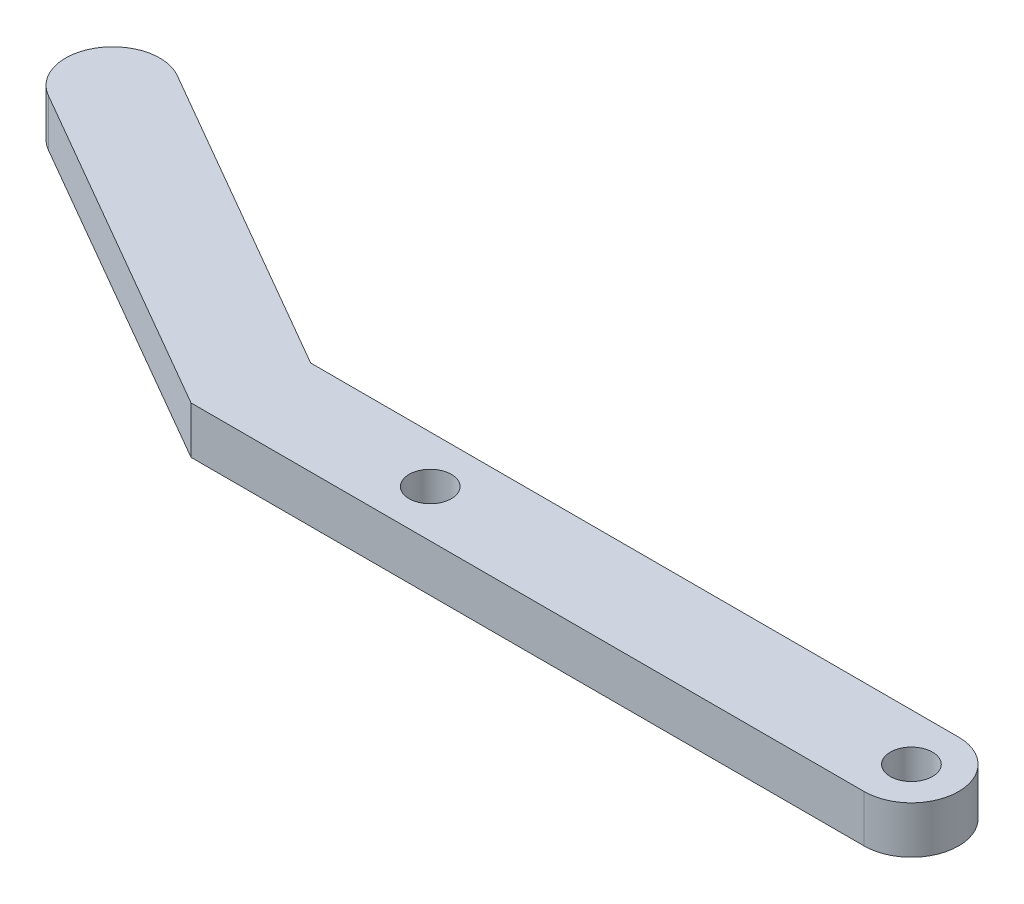
ISO-10303-21;
HEADER;
FILE_DESCRIPTION(('STEP AP214'),'2;1');
FILE_NAME('part.step','',(''),(''),'','','');
FILE_SCHEMA(('AUTOMOTIVE_DESIGN { 1 0 10303 214 1 1 1 1 }'));
ENDSEC;
DATA;
#1=APPLICATION_CONTEXT('core data for automotive mechanical design processes');
#2=APPLICATION_PROTOCOL_DEFINITION('international standard','automotive_design',2000,#1);
#3=PRODUCT_CONTEXT('',#1,'mechanical');
#4=PRODUCT('Part','Part','',(#3));
#5=PRODUCT_RELATED_PRODUCT_CATEGORY('part','',(#4));
#6=PRODUCT_DEFINITION_FORMATION('','',#4);
#7=PRODUCT_DEFINITION_CONTEXT('part definition',#1,'design');
#8=PRODUCT_DEFINITION('design','',#6,#7);
#9=PRODUCT_DEFINITION_SHAPE('','',#8);
#10=(LENGTH_UNIT() NAMED_UNIT(*) SI_UNIT(.MILLI.,.METRE.));
#11=(NAMED_UNIT(*) PLANE_ANGLE_UNIT() SI_UNIT($,.RADIAN.));
#12=(NAMED_UNIT(*) SI_UNIT($,.STERADIAN.) SOLID_ANGLE_UNIT());
#13=UNCERTAINTY_MEASURE_WITH_UNIT(LENGTH_MEASURE(1.E-05),#10,'distance_accuracy_value','');
#14=(GEOMETRIC_REPRESENTATION_CONTEXT(3) GLOBAL_UNCERTAINTY_ASSIGNED_CONTEXT((#13)) GLOBAL_UNIT_ASSIGNED_CONTEXT((#10,
#11,#12)) REPRESENTATION_CONTEXT('',''));
#15=CARTESIAN_POINT('',(0.,0.,0.));
#16=DIRECTION('',(0.,0.,1.));
#17=DIRECTION('',(1.,0.,0.));
#18=AXIS2_PLACEMENT_3D('',#15,#16,#17);
#19=CARTESIAN_POINT('',(-44.2220452561248,3.175,-12.6999999999999));
#20=DIRECTION('',(0.,1.,0.));
#21=DIRECTION('',(0.,0.,1.));
#22=AXIS2_PLACEMENT_3D('',#19,#20,#21);
#23=PLANE('',#22);
#24=CARTESIAN_POINT('',(22.225,3.175,0.));
#25=DIRECTION('',(0.,1.,0.));
#26=DIRECTION('',(0.,0.,1.));
#27=AXIS2_PLACEMENT_3D('',#24,#25,#26);
#28=CIRCLE('',#27,1.4224);
#29=CARTESIAN_POINT('',(22.225,3.175,1.4224));
#30=VERTEX_POINT('',#29);
#31=EDGE_CURVE('E122',#30,#30,#28,.T.);
#32=ORIENTED_EDGE('',*,*,#31,.F.);
#33=EDGE_LOOP('',(#32));
#34=FACE_BOUND('',#33,.T.);
#35=DIRECTION('',(-0.866025403784442,0.,-0.499999999999995));
#36=VECTOR('',#35,1.);
#37=CARTESIAN_POINT('',(-21.3742613140312,3.175,-3.175));
#38=LINE('',#37,#36);
#39=CARTESIAN_POINT('',(-21.3742613140312,3.175,-3.175));
#40=VERTEX_POINT('',#39);
#41=CARTESIAN_POINT('',(-42.6345452561248,3.175,-15.4496306570155));
#42=VERTEX_POINT('',#41);
#43=EDGE_CURVE('E129',#40,#42,#38,.T.);
#44=ORIENTED_EDGE('',*,*,#43,.T.);
#45=CARTESIAN_POINT('',(-44.2220452561248,3.175,-12.6999999999999));
#46=DIRECTION('',(0.,1.,0.));
#47=DIRECTION('',(0.,0.,1.));
#48=AXIS2_PLACEMENT_3D('',#45,#46,#47);
#49=CIRCLE('',#48,3.175);
#50=CARTESIAN_POINT('',(-45.8095452561248,3.175,-9.95036934298426));
#51=VERTEX_POINT('',#50);
#52=EDGE_CURVE('E87',#42,#51,#49,.T.);
#53=ORIENTED_EDGE('',*,*,#52,.T.);
#54=DIRECTION('',(0.866025403784442,0.,0.499999999999995));
#55=VECTOR('',#54,1.);
#56=CARTESIAN_POINT('',(-23.0757386859688,3.175,3.175));
#57=LINE('',#56,#55);
#58=CARTESIAN_POINT('',(-23.0757386859688,3.175,3.175));
#59=VERTEX_POINT('',#58);
#60=EDGE_CURVE('E100',#51,#59,#57,.T.);
#61=ORIENTED_EDGE('',*,*,#60,.T.);
#62=DIRECTION('',(1.,0.,0.));
#63=VECTOR('',#62,1.);
#64=CARTESIAN_POINT('',(-23.0757386859688,3.175,3.175));
#65=LINE('',#64,#63);
#66=CARTESIAN_POINT('',(22.225,3.175,3.175));
#67=VERTEX_POINT('',#66);
#68=EDGE_CURVE('E94',#59,#67,#65,.T.);
#69=ORIENTED_EDGE('',*,*,#68,.T.);
#70=CARTESIAN_POINT('',(22.225,3.175,0.));
#71=DIRECTION('',(0.,1.,0.));
#72=DIRECTION('',(0.,0.,-1.));
#73=AXIS2_PLACEMENT_3D('',#70,#71,#72);
#74=CIRCLE('',#73,3.175);
#75=CARTESIAN_POINT('',(22.225,3.175,-3.175));
#76=VERTEX_POINT('',#75);
#77=EDGE_CURVE('E98',#67,#76,#74,.T.);
#78=ORIENTED_EDGE('',*,*,#77,.T.);
#79=DIRECTION('',(-1.,0.,0.));
#80=VECTOR('',#79,1.);
#81=CARTESIAN_POINT('',(-21.3742613140312,3.175,-3.175));
#82=LINE('',#81,#80);
#83=EDGE_CURVE('E50',#76,#40,#82,.T.);
#84=ORIENTED_EDGE('',*,*,#83,.T.);
#85=EDGE_LOOP('',(#44,#53,#61,#69,#78,#84));
#86=FACE_BOUND('',#85,.T.);
#87=CARTESIAN_POINT('',(-10.15492,3.175,0.));
#88=DIRECTION('',(0.,1.,0.));
#89=DIRECTION('',(0.,0.,1.));
#90=AXIS2_PLACEMENT_3D('',#87,#88,#89);
#91=CIRCLE('',#90,1.4224);
#92=CARTESIAN_POINT('',(-10.15492,3.175,1.4224));
#93=VERTEX_POINT('',#92);
#94=EDGE_CURVE('E172',#93,#93,#91,.T.);
#95=ORIENTED_EDGE('',*,*,#94,.F.);
#96=EDGE_LOOP('',(#95));
#97=FACE_BOUND('',#96,.T.);
#98=ADVANCED_FACE('F33',(#34,#86,#97),#23,.T.);
#99=CARTESIAN_POINT('',(-44.2220452561248,0.,-12.6999999999999));
#100=DIRECTION('',(0.,1.,0.));
#101=DIRECTION('',(0.,0.,1.));
#102=AXIS2_PLACEMENT_3D('',#99,#100,#101);
#103=PLANE('',#102);
#104=CARTESIAN_POINT('',(22.225,0.,0.));
#105=DIRECTION('',(0.,1.,0.));
#106=DIRECTION('',(0.,0.,1.));
#107=AXIS2_PLACEMENT_3D('',#104,#105,#106);
#108=CIRCLE('',#107,1.4224);
#109=CARTESIAN_POINT('',(22.225,0.,1.4224));
#110=VERTEX_POINT('',#109);
#111=EDGE_CURVE('E177',#110,#110,#108,.T.);
#112=ORIENTED_EDGE('',*,*,#111,.T.);
#113=EDGE_LOOP('',(#112));
#114=FACE_BOUND('',#113,.T.);
#115=DIRECTION('',(-0.866025403784442,0.,-0.499999999999995));
#116=VECTOR('',#115,1.);
#117=CARTESIAN_POINT('',(-21.3742613140312,0.,-3.175));
#118=LINE('',#117,#116);
#119=CARTESIAN_POINT('',(-21.3742613140312,0.,-3.175));
#120=VERTEX_POINT('',#119);
#121=CARTESIAN_POINT('',(-42.6345452561248,0.,-15.4496306570155));
#122=VERTEX_POINT('',#121);
#123=EDGE_CURVE('E118',#120,#122,#118,.T.);
#124=ORIENTED_EDGE('',*,*,#123,.F.);
#125=DIRECTION('',(-1.,0.,0.));
#126=VECTOR('',#125,1.);
#127=CARTESIAN_POINT('',(-21.3742613140312,0.,-3.175));
#128=LINE('',#127,#126);
#129=CARTESIAN_POINT('',(22.225,0.,-3.175));
#130=VERTEX_POINT('',#129);
#131=EDGE_CURVE('E79',#130,#120,#128,.T.);
#132=ORIENTED_EDGE('',*,*,#131,.F.);
#133=CARTESIAN_POINT('',(22.225,0.,0.));
#134=DIRECTION('',(0.,1.,0.));
#135=DIRECTION('',(0.,0.,-1.));
#136=AXIS2_PLACEMENT_3D('',#133,#134,#135);
#137=CIRCLE('',#136,3.175);
#138=CARTESIAN_POINT('',(22.225,0.,3.175));
#139=VERTEX_POINT('',#138);
#140=EDGE_CURVE('E73',#139,#130,#137,.T.);
#141=ORIENTED_EDGE('',*,*,#140,.F.);
#142=DIRECTION('',(1.,0.,0.));
#143=VECTOR('',#142,1.);
#144=CARTESIAN_POINT('',(-23.0757386859688,0.,3.175));
#145=LINE('',#144,#143);
#146=CARTESIAN_POINT('',(-23.0757386859688,0.,3.175));
#147=VERTEX_POINT('',#146);
#148=EDGE_CURVE('E108',#147,#139,#145,.T.);
#149=ORIENTED_EDGE('',*,*,#148,.F.);
#150=DIRECTION('',(0.866025403784442,0.,0.499999999999995));
#151=VECTOR('',#150,1.);
#152=CARTESIAN_POINT('',(-23.0757386859688,0.,3.175));
#153=LINE('',#152,#151);
#154=CARTESIAN_POINT('',(-45.8095452561248,0.,-9.95036934298426));
#155=VERTEX_POINT('',#154);
#156=EDGE_CURVE('E124',#155,#147,#153,.T.);
#157=ORIENTED_EDGE('',*,*,#156,.F.);
#158=CARTESIAN_POINT('',(-44.2220452561248,0.,-12.6999999999999));
#159=DIRECTION('',(0.,1.,0.));
#160=DIRECTION('',(0.,0.,1.));
#161=AXIS2_PLACEMENT_3D('',#158,#159,#160);
#162=CIRCLE('',#161,3.175);
#163=EDGE_CURVE('E121',#122,#155,#162,.T.);
#164=ORIENTED_EDGE('',*,*,#163,.F.);
#165=EDGE_LOOP('',(#124,#132,#141,#149,#157,#164));
#166=FACE_BOUND('',#165,.T.);
#167=CARTESIAN_POINT('',(-10.15492,0.,0.));
#168=DIRECTION('',(0.,1.,0.));
#169=DIRECTION('',(0.,0.,1.));
#170=AXIS2_PLACEMENT_3D('',#167,#168,#169);
#171=CIRCLE('',#170,1.4224);
#172=CARTESIAN_POINT('',(-10.15492,0.,1.4224));
#173=VERTEX_POINT('',#172);
#174=EDGE_CURVE('E175',#173,#173,#171,.T.);
#175=ORIENTED_EDGE('',*,*,#174,.T.);
#176=EDGE_LOOP('',(#175));
#177=FACE_BOUND('',#176,.T.);
#178=ADVANCED_FACE('F138',(#114,#166,#177),#103,.F.);
#179=CARTESIAN_POINT('',(-21.3742613140312,3.175,-3.175));
#180=DIRECTION('',(-0.499999999999995,0.,0.866025403784442));
#181=DIRECTION('',(0.866025403784442,0.,0.499999999999995));
#182=AXIS2_PLACEMENT_3D('',#179,#180,#181);
#183=PLANE('',#182);
#184=ORIENTED_EDGE('',*,*,#123,.T.);
#185=DIRECTION('',(0.,-1.,0.));
#186=VECTOR('',#185,1.);
#187=CARTESIAN_POINT('',(-42.6345452561248,3.175,-15.4496306570155));
#188=LINE('',#187,#186);
#189=EDGE_CURVE('E11',#42,#122,#188,.T.);
#190=ORIENTED_EDGE('',*,*,#189,.F.);
#191=ORIENTED_EDGE('',*,*,#43,.F.);
#192=DIRECTION('',(0.,-1.,0.));
#193=VECTOR('',#192,1.);
#194=CARTESIAN_POINT('',(-21.3742613140312,3.175,-3.175));
#195=LINE('',#194,#193);
#196=EDGE_CURVE('E114',#40,#120,#195,.T.);
#197=ORIENTED_EDGE('',*,*,#196,.T.);
#198=EDGE_LOOP('',(#184,#190,#191,#197));
#199=FACE_BOUND('',#198,.T.);
#200=ADVANCED_FACE('F35',(#199),#183,.F.);
#201=CARTESIAN_POINT('',(-44.2220452561248,3.175,-12.6999999999999));
#202=DIRECTION('',(0.,-1.,0.));
#203=DIRECTION('',(0.,0.,-1.));
#204=AXIS2_PLACEMENT_3D('',#201,#202,#203);
#205=CYLINDRICAL_SURFACE('',#204,3.175);
#206=ORIENTED_EDGE('',*,*,#163,.T.);
#207=DIRECTION('',(0.,-1.,0.));
#208=VECTOR('',#207,1.);
#209=CARTESIAN_POINT('',(-45.8095452561248,3.175,-9.95036934298426));
#210=LINE('',#209,#208);
#211=EDGE_CURVE('E42',#51,#155,#210,.T.);
#212=ORIENTED_EDGE('',*,*,#211,.F.);
#213=ORIENTED_EDGE('',*,*,#52,.F.);
#214=ORIENTED_EDGE('',*,*,#189,.T.);
#215=EDGE_LOOP('',(#206,#212,#213,#214));
#216=FACE_BOUND('',#215,.T.);
#217=ADVANCED_FACE('F218',(#216),#205,.T.);
#218=CARTESIAN_POINT('',(-23.0757386859688,3.175,3.175));
#219=DIRECTION('',(0.499999999999995,0.,-0.866025403784442));
#220=DIRECTION('',(-0.866025403784442,0.,-0.499999999999995));
#221=AXIS2_PLACEMENT_3D('',#218,#219,#220);
#222=PLANE('',#221);
#223=ORIENTED_EDGE('',*,*,#156,.T.);
#224=DIRECTION('',(0.,-1.,0.));
#225=VECTOR('',#224,1.);
#226=CARTESIAN_POINT('',(-23.0757386859688,3.175,3.175));
#227=LINE('',#226,#225);
#228=EDGE_CURVE('E109',#59,#147,#227,.T.);
#229=ORIENTED_EDGE('',*,*,#228,.F.);
#230=ORIENTED_EDGE('',*,*,#60,.F.);
#231=ORIENTED_EDGE('',*,*,#211,.T.);
#232=EDGE_LOOP('',(#223,#229,#230,#231));
#233=FACE_BOUND('',#232,.T.);
#234=ADVANCED_FACE('F135',(#233),#222,.F.);
#235=CARTESIAN_POINT('',(-23.0757386859688,3.175,3.175));
#236=DIRECTION('',(0.,0.,-1.));
#237=DIRECTION('',(-1.,0.,0.));
#238=AXIS2_PLACEMENT_3D('',#235,#236,#237);
#239=PLANE('',#238);
#240=ORIENTED_EDGE('',*,*,#148,.T.);
#241=DIRECTION('',(0.,-1.,0.));
#242=VECTOR('',#241,1.);
#243=CARTESIAN_POINT('',(22.225,3.175,3.175));
#244=LINE('',#243,#242);
#245=EDGE_CURVE('E105',#67,#139,#244,.T.);
#246=ORIENTED_EDGE('',*,*,#245,.F.);
#247=ORIENTED_EDGE('',*,*,#68,.F.);
#248=ORIENTED_EDGE('',*,*,#228,.T.);
#249=EDGE_LOOP('',(#240,#246,#247,#248));
#250=FACE_BOUND('',#249,.T.);
#251=ADVANCED_FACE('F106',(#250),#239,.F.);
#252=CARTESIAN_POINT('',(22.225,3.175,0.));
#253=DIRECTION('',(0.,-1.,0.));
#254=DIRECTION('',(0.,0.,-1.));
#255=AXIS2_PLACEMENT_3D('',#252,#253,#254);
#256=CYLINDRICAL_SURFACE('',#255,3.175);
#257=ORIENTED_EDGE('',*,*,#140,.T.);
#258=DIRECTION('',(0.,-1.,0.));
#259=VECTOR('',#258,1.);
#260=CARTESIAN_POINT('',(22.225,3.175,-3.175));
#261=LINE('',#260,#259);
#262=EDGE_CURVE('E110',#76,#130,#261,.T.);
#263=ORIENTED_EDGE('',*,*,#262,.F.);
#264=ORIENTED_EDGE('',*,*,#77,.F.);
#265=ORIENTED_EDGE('',*,*,#245,.T.);
#266=EDGE_LOOP('',(#257,#263,#264,#265));
#267=FACE_BOUND('',#266,.T.);
#268=ADVANCED_FACE('F112',(#267),#256,.T.);
#269=CARTESIAN_POINT('',(-21.3742613140312,3.175,-3.175));
#270=DIRECTION('',(0.,0.,1.));
#271=DIRECTION('',(1.,0.,0.));
#272=AXIS2_PLACEMENT_3D('',#269,#270,#271);
#273=PLANE('',#272);
#274=ORIENTED_EDGE('',*,*,#131,.T.);
#275=ORIENTED_EDGE('',*,*,#196,.F.);
#276=ORIENTED_EDGE('',*,*,#83,.F.);
#277=ORIENTED_EDGE('',*,*,#262,.T.);
#278=EDGE_LOOP('',(#274,#275,#276,#277));
#279=FACE_BOUND('',#278,.T.);
#280=ADVANCED_FACE('F143',(#279),#273,.F.);
#281=CARTESIAN_POINT('',(22.225,3.175,0.));
#282=DIRECTION('',(0.,-1.,0.));
#283=DIRECTION('',(0.,0.,-1.));
#284=AXIS2_PLACEMENT_3D('',#281,#282,#283);
#285=CYLINDRICAL_SURFACE('',#284,1.4224);
#286=ORIENTED_EDGE('',*,*,#31,.T.);
#287=EDGE_LOOP('',(#286));
#288=FACE_BOUND('',#287,.T.);
#289=ORIENTED_EDGE('',*,*,#111,.F.);
#290=EDGE_LOOP('',(#289));
#291=FACE_BOUND('',#290,.T.);
#292=ADVANCED_FACE('F145',(#288,#291),#285,.F.);
#293=CARTESIAN_POINT('',(-10.15492,3.175,0.));
#294=DIRECTION('',(0.,-1.,0.));
#295=DIRECTION('',(0.,0.,-1.));
#296=AXIS2_PLACEMENT_3D('',#293,#294,#295);
#297=CYLINDRICAL_SURFACE('',#296,1.4224);
#298=ORIENTED_EDGE('',*,*,#94,.T.);
#299=EDGE_LOOP('',(#298));
#300=FACE_BOUND('',#299,.T.);
#301=ORIENTED_EDGE('',*,*,#174,.F.);
#302=EDGE_LOOP('',(#301));
#303=FACE_BOUND('',#302,.T.);
#304=ADVANCED_FACE('F151',(#300,#303),#297,.F.);
#305=CLOSED_SHELL('',(#98,#178,#200,#217,#234,#251,#268,#280,#292,#304));
#306=MANIFOLD_SOLID_BREP('B2',#305);
#307=ADVANCED_BREP_SHAPE_REPRESENTATION('',(#18,#306),#14);
#308=SHAPE_DEFINITION_REPRESENTATION(#9,#307);
ENDSEC;
END-ISO-10303-21;
